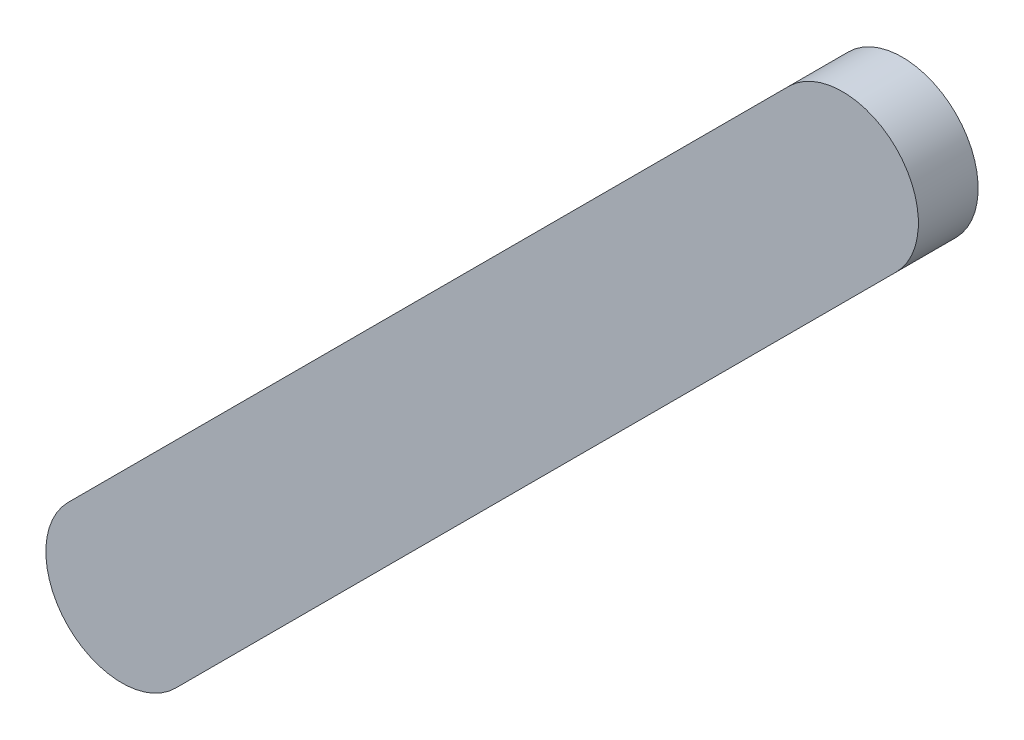
ISO-10303-21;
HEADER;
FILE_DESCRIPTION(('STEP AP214'),'2;1');
FILE_NAME('part.step','',(''),(''),'','','');
FILE_SCHEMA(('AUTOMOTIVE_DESIGN { 1 0 10303 214 1 1 1 1 }'));
ENDSEC;
DATA;
#1=APPLICATION_CONTEXT('core data for automotive mechanical design processes');
#2=APPLICATION_PROTOCOL_DEFINITION('international standard','automotive_design',2000,#1);
#3=PRODUCT_CONTEXT('',#1,'mechanical');
#4=PRODUCT('Part','Part','',(#3));
#5=PRODUCT_RELATED_PRODUCT_CATEGORY('part','',(#4));
#6=PRODUCT_DEFINITION_FORMATION('','',#4);
#7=PRODUCT_DEFINITION_CONTEXT('part definition',#1,'design');
#8=PRODUCT_DEFINITION('design','',#6,#7);
#9=PRODUCT_DEFINITION_SHAPE('','',#8);
#10=(LENGTH_UNIT() NAMED_UNIT(*) SI_UNIT(.MILLI.,.METRE.));
#11=(NAMED_UNIT(*) PLANE_ANGLE_UNIT() SI_UNIT($,.RADIAN.));
#12=(NAMED_UNIT(*) SI_UNIT($,.STERADIAN.) SOLID_ANGLE_UNIT());
#13=UNCERTAINTY_MEASURE_WITH_UNIT(LENGTH_MEASURE(1.E-05),#10,'distance_accuracy_value','');
#14=(GEOMETRIC_REPRESENTATION_CONTEXT(3) GLOBAL_UNCERTAINTY_ASSIGNED_CONTEXT((#13)) GLOBAL_UNIT_ASSIGNED_CONTEXT((#10,
#11,#12)) REPRESENTATION_CONTEXT('',''));
#15=CARTESIAN_POINT('',(0.,0.,0.));
#16=DIRECTION('',(0.,0.,1.));
#17=DIRECTION('',(1.,0.,0.));
#18=AXIS2_PLACEMENT_3D('',#15,#16,#17);
#19=CARTESIAN_POINT('',(109.14560594,118.8955966,0.));
#20=DIRECTION('',(-0.707106781186545,0.70710678118655,0.));
#21=DIRECTION('',(0.70710678118655,0.707106781186545,0.));
#22=AXIS2_PLACEMENT_3D('',#19,#20,#21);
#23=PLANE('',#22);
#24=DIRECTION('',(0.70710678118655,0.707106781186545,0.));
#25=VECTOR('',#24,1.);
#26=CARTESIAN_POINT('',(109.14560594,118.8955966,0.1999996));
#27=LINE('',#26,#25);
#28=CARTESIAN_POINT('',(109.14560594,118.8955966,0.1999996));
#29=VERTEX_POINT('',#28);
#30=CARTESIAN_POINT('',(111.5586034,121.30859406,0.1999996));
#31=VERTEX_POINT('',#30);
#32=EDGE_CURVE('E11',#29,#31,#27,.T.);
#33=ORIENTED_EDGE('',*,*,#32,.F.);
#34=DIRECTION('',(0.,0.,1.));
#35=VECTOR('',#34,1.);
#36=CARTESIAN_POINT('',(109.14560594,118.8955966,0.));
#37=LINE('',#36,#35);
#38=CARTESIAN_POINT('',(109.14560594,118.8955966,0.));
#39=VERTEX_POINT('',#38);
#40=EDGE_CURVE('E24',#39,#29,#37,.T.);
#41=ORIENTED_EDGE('',*,*,#40,.F.);
#42=DIRECTION('',(0.70710678118655,0.707106781186545,0.));
#43=VECTOR('',#42,1.);
#44=CARTESIAN_POINT('',(109.14560594,118.8955966,0.));
#45=LINE('',#44,#43);
#46=CARTESIAN_POINT('',(111.5586034,121.30859406,0.));
#47=VERTEX_POINT('',#46);
#48=EDGE_CURVE('E75',#39,#47,#45,.T.);
#49=ORIENTED_EDGE('',*,*,#48,.T.);
#50=DIRECTION('',(0.,0.,1.));
#51=VECTOR('',#50,1.);
#52=CARTESIAN_POINT('',(111.5586034,121.30859406,0.));
#53=LINE('',#52,#51);
#54=EDGE_CURVE('E37',#47,#31,#53,.T.);
#55=ORIENTED_EDGE('',*,*,#54,.T.);
#56=EDGE_LOOP('',(#33,#41,#49,#55));
#57=FACE_BOUND('',#56,.T.);
#58=ADVANCED_FACE('F17',(#57),#23,.F.);
#59=CARTESIAN_POINT('',(111.37899873,121.48819873,0.));
#60=DIRECTION('',(0.,0.,-1.));
#61=DIRECTION('',(0.707106781186548,-0.707106781186548,0.));
#62=AXIS2_PLACEMENT_3D('',#59,#60,#61);
#63=CYLINDRICAL_SURFACE('',#62,0.253999360179549);
#64=CARTESIAN_POINT('',(111.37899873,121.48819873,0.1999996));
#65=DIRECTION('',(0.,0.,1.));
#66=DIRECTION('',(0.707106781186548,-0.707106781186548,0.));
#67=AXIS2_PLACEMENT_3D('',#64,#65,#66);
#68=CIRCLE('',#67,0.253999360179549);
#69=CARTESIAN_POINT('',(111.19939406,121.6678034,0.1999996));
#70=VERTEX_POINT('',#69);
#71=EDGE_CURVE('E83',#31,#70,#68,.T.);
#72=ORIENTED_EDGE('',*,*,#71,.F.);
#73=ORIENTED_EDGE('',*,*,#54,.F.);
#74=CARTESIAN_POINT('',(111.37899873,121.48819873,0.));
#75=DIRECTION('',(0.,0.,1.));
#76=DIRECTION('',(0.707106781186548,-0.707106781186548,0.));
#77=AXIS2_PLACEMENT_3D('',#74,#75,#76);
#78=CIRCLE('',#77,0.253999360179549);
#79=CARTESIAN_POINT('',(111.19939406,121.6678034,0.));
#80=VERTEX_POINT('',#79);
#81=EDGE_CURVE('E81',#47,#80,#78,.T.);
#82=ORIENTED_EDGE('',*,*,#81,.T.);
#83=DIRECTION('',(0.,0.,1.));
#84=VECTOR('',#83,1.);
#85=CARTESIAN_POINT('',(111.19939406,121.6678034,0.));
#86=LINE('',#85,#84);
#87=EDGE_CURVE('E67',#80,#70,#86,.T.);
#88=ORIENTED_EDGE('',*,*,#87,.T.);
#89=EDGE_LOOP('',(#72,#73,#82,#88));
#90=FACE_BOUND('',#89,.T.);
#91=ADVANCED_FACE('F89',(#90),#63,.T.);
#92=CARTESIAN_POINT('',(111.19939406,121.6678034,0.));
#93=DIRECTION('',(0.70710678118655,-0.707106781186545,0.));
#94=DIRECTION('',(-0.707106781186545,-0.70710678118655,0.));
#95=AXIS2_PLACEMENT_3D('',#92,#93,#94);
#96=PLANE('',#95);
#97=DIRECTION('',(-0.707106781186545,-0.70710678118655,0.));
#98=VECTOR('',#97,1.);
#99=CARTESIAN_POINT('',(111.19939406,121.6678034,0.1999996));
#100=LINE('',#99,#98);
#101=CARTESIAN_POINT('',(108.7863966,119.25480594,0.1999996));
#102=VERTEX_POINT('',#101);
#103=EDGE_CURVE('E71',#70,#102,#100,.T.);
#104=ORIENTED_EDGE('',*,*,#103,.F.);
#105=ORIENTED_EDGE('',*,*,#87,.F.);
#106=DIRECTION('',(-0.707106781186545,-0.70710678118655,0.));
#107=VECTOR('',#106,1.);
#108=CARTESIAN_POINT('',(111.19939406,121.6678034,0.));
#109=LINE('',#108,#107);
#110=CARTESIAN_POINT('',(108.7863966,119.25480594,0.));
#111=VERTEX_POINT('',#110);
#112=EDGE_CURVE('E63',#80,#111,#109,.T.);
#113=ORIENTED_EDGE('',*,*,#112,.T.);
#114=DIRECTION('',(0.,0.,1.));
#115=VECTOR('',#114,1.);
#116=CARTESIAN_POINT('',(108.7863966,119.25480594,0.));
#117=LINE('',#116,#115);
#118=EDGE_CURVE('E53',#111,#102,#117,.T.);
#119=ORIENTED_EDGE('',*,*,#118,.T.);
#120=EDGE_LOOP('',(#104,#105,#113,#119));
#121=FACE_BOUND('',#120,.T.);
#122=ADVANCED_FACE('F66',(#121),#96,.F.);
#123=CARTESIAN_POINT('',(108.96600127,119.07520127,0.));
#124=DIRECTION('',(0.,0.,-1.));
#125=DIRECTION('',(-0.707106781186548,0.707106781186548,0.));
#126=AXIS2_PLACEMENT_3D('',#123,#124,#125);
#127=CYLINDRICAL_SURFACE('',#126,0.253999360179539);
#128=CARTESIAN_POINT('',(108.96600127,119.07520127,0.1999996));
#129=DIRECTION('',(0.,0.,1.));
#130=DIRECTION('',(-0.707106781186548,0.707106781186548,0.));
#131=AXIS2_PLACEMENT_3D('',#128,#129,#130);
#132=CIRCLE('',#131,0.253999360179539);
#133=EDGE_CURVE('E59',#102,#29,#132,.T.);
#134=ORIENTED_EDGE('',*,*,#133,.F.);
#135=ORIENTED_EDGE('',*,*,#118,.F.);
#136=CARTESIAN_POINT('',(108.96600127,119.07520127,0.));
#137=DIRECTION('',(0.,0.,1.));
#138=DIRECTION('',(-0.707106781186548,0.707106781186548,0.));
#139=AXIS2_PLACEMENT_3D('',#136,#137,#138);
#140=CIRCLE('',#139,0.253999360179539);
#141=EDGE_CURVE('E57',#111,#39,#140,.T.);
#142=ORIENTED_EDGE('',*,*,#141,.T.);
#143=ORIENTED_EDGE('',*,*,#40,.T.);
#144=EDGE_LOOP('',(#134,#135,#142,#143));
#145=FACE_BOUND('',#144,.T.);
#146=ADVANCED_FACE('F55',(#145),#127,.T.);
#147=CARTESIAN_POINT('',(109.14560594,118.8955966,0.));
#148=DIRECTION('',(0.,0.,-1.));
#149=DIRECTION('',(-1.,0.,0.));
#150=AXIS2_PLACEMENT_3D('',#147,#148,#149);
#151=PLANE('',#150);
#152=ORIENTED_EDGE('',*,*,#141,.F.);
#153=ORIENTED_EDGE('',*,*,#112,.F.);
#154=ORIENTED_EDGE('',*,*,#81,.F.);
#155=ORIENTED_EDGE('',*,*,#48,.F.);
#156=EDGE_LOOP('',(#152,#153,#154,#155));
#157=FACE_BOUND('',#156,.T.);
#158=ADVANCED_FACE('F74',(#157),#151,.T.);
#159=CARTESIAN_POINT('',(109.14560594,118.8955966,0.1999996));
#160=DIRECTION('',(0.,0.,-1.));
#161=DIRECTION('',(-1.,0.,0.));
#162=AXIS2_PLACEMENT_3D('',#159,#160,#161);
#163=PLANE('',#162);
#164=ORIENTED_EDGE('',*,*,#32,.T.);
#165=ORIENTED_EDGE('',*,*,#71,.T.);
#166=ORIENTED_EDGE('',*,*,#103,.T.);
#167=ORIENTED_EDGE('',*,*,#133,.T.);
#168=EDGE_LOOP('',(#164,#165,#166,#167));
#169=FACE_BOUND('',#168,.T.);
#170=ADVANCED_FACE('F91',(#169),#163,.F.);
#171=CLOSED_SHELL('',(#58,#91,#122,#146,#158,#170));
#172=MANIFOLD_SOLID_BREP('B1',#171);
#173=ADVANCED_BREP_SHAPE_REPRESENTATION('',(#18,#172),#14);
#174=SHAPE_DEFINITION_REPRESENTATION(#9,#173);
ENDSEC;
END-ISO-10303-21;
